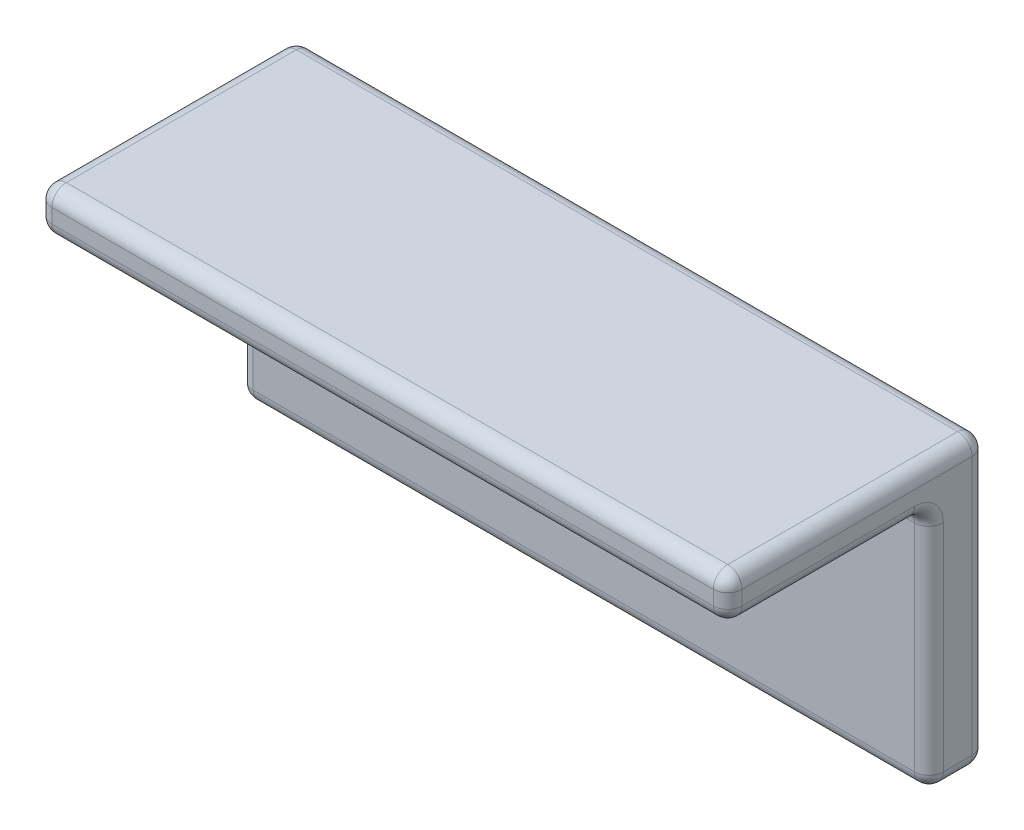
ISO-10303-21;
HEADER;
FILE_DESCRIPTION(('STEP AP214'),'2;1');
FILE_NAME('part.step','',(''),(''),'','','');
FILE_SCHEMA(('AUTOMOTIVE_DESIGN { 1 0 10303 214 1 1 1 1 }'));
ENDSEC;
DATA;
#1=APPLICATION_CONTEXT('core data for automotive mechanical design processes');
#2=APPLICATION_PROTOCOL_DEFINITION('international standard','automotive_design',2000,#1);
#3=PRODUCT_CONTEXT('',#1,'mechanical');
#4=PRODUCT('Part','Part','',(#3));
#5=PRODUCT_RELATED_PRODUCT_CATEGORY('part','',(#4));
#6=PRODUCT_DEFINITION_FORMATION('','',#4);
#7=PRODUCT_DEFINITION_CONTEXT('part definition',#1,'design');
#8=PRODUCT_DEFINITION('design','',#6,#7);
#9=PRODUCT_DEFINITION_SHAPE('','',#8);
#10=(LENGTH_UNIT() NAMED_UNIT(*) SI_UNIT(.MILLI.,.METRE.));
#11=(NAMED_UNIT(*) PLANE_ANGLE_UNIT() SI_UNIT($,.RADIAN.));
#12=(NAMED_UNIT(*) SI_UNIT($,.STERADIAN.) SOLID_ANGLE_UNIT());
#13=UNCERTAINTY_MEASURE_WITH_UNIT(LENGTH_MEASURE(1.E-05),#10,'distance_accuracy_value','');
#14=(GEOMETRIC_REPRESENTATION_CONTEXT(3) GLOBAL_UNCERTAINTY_ASSIGNED_CONTEXT((#13)) GLOBAL_UNIT_ASSIGNED_CONTEXT((#10,
#11,#12)) REPRESENTATION_CONTEXT('',''));
#15=CARTESIAN_POINT('',(0.,0.,0.));
#16=DIRECTION('',(0.,0.,1.));
#17=DIRECTION('',(1.,0.,0.));
#18=AXIS2_PLACEMENT_3D('',#15,#16,#17);
#19=CARTESIAN_POINT('',(0.,0.,2.));
#20=DIRECTION('',(0.,0.,-1.));
#21=DIRECTION('',(-1.,0.,0.));
#22=AXIS2_PLACEMENT_3D('',#19,#20,#21);
#23=PLANE('',#22);
#24=DIRECTION('',(1.,0.,0.));
#25=VECTOR('',#24,1.);
#26=CARTESIAN_POINT('',(0.,0.5,2.));
#27=LINE('',#26,#25);
#28=CARTESIAN_POINT('',(0.5,0.5,2.));
#29=VERTEX_POINT('',#28);
#30=CARTESIAN_POINT('',(23.5,0.5,2.));
#31=VERTEX_POINT('',#30);
#32=EDGE_CURVE('E42',#29,#31,#27,.T.);
#33=ORIENTED_EDGE('',*,*,#32,.T.);
#34=DIRECTION('',(0.,1.,0.));
#35=VECTOR('',#34,1.);
#36=CARTESIAN_POINT('',(23.5,0.,2.));
#37=LINE('',#36,#35);
#38=CARTESIAN_POINT('',(23.5,8.,2.));
#39=VERTEX_POINT('',#38);
#40=EDGE_CURVE('E11',#31,#39,#37,.T.);
#41=ORIENTED_EDGE('',*,*,#40,.T.);
#42=DIRECTION('',(1.,0.,0.));
#43=VECTOR('',#42,1.);
#44=CARTESIAN_POINT('',(0.,8.,2.));
#45=LINE('',#44,#43);
#46=CARTESIAN_POINT('',(0.499999999999997,8.,2.));
#47=VERTEX_POINT('',#46);
#48=EDGE_CURVE('E284',#39,#47,#45,.F.);
#49=ORIENTED_EDGE('',*,*,#48,.T.);
#50=DIRECTION('',(0.,-1.,0.));
#51=VECTOR('',#50,1.);
#52=CARTESIAN_POINT('',(0.5,0.,2.));
#53=LINE('',#52,#51);
#54=EDGE_CURVE('E53',#47,#29,#53,.T.);
#55=ORIENTED_EDGE('',*,*,#54,.T.);
#56=EDGE_LOOP('',(#33,#41,#49,#55));
#57=FACE_BOUND('',#56,.T.);
#58=CARTESIAN_POINT('',(12.,5.,2.));
#59=DIRECTION('',(0.,0.,-1.));
#60=DIRECTION('',(-1.,0.,0.));
#61=AXIS2_PLACEMENT_3D('',#58,#59,#60);
#62=CIRCLE('',#61,2.25);
#63=CARTESIAN_POINT('',(9.75,5.,2.));
#64=VERTEX_POINT('',#63);
#65=EDGE_CURVE('E281',#64,#64,#62,.T.);
#66=ORIENTED_EDGE('',*,*,#65,.T.);
#67=EDGE_LOOP('',(#66));
#68=FACE_BOUND('',#67,.T.);
#69=ADVANCED_FACE('F33',(#57,#68),#23,.F.);
#70=CARTESIAN_POINT('',(0.,0.,0.));
#71=DIRECTION('',(0.,0.,-1.));
#72=DIRECTION('',(-1.,0.,0.));
#73=AXIS2_PLACEMENT_3D('',#70,#71,#72);
#74=PLANE('',#73);
#75=CARTESIAN_POINT('',(12.,5.,0.));
#76=DIRECTION('',(0.,0.,-1.));
#77=DIRECTION('',(-1.,0.,0.));
#78=AXIS2_PLACEMENT_3D('',#75,#76,#77);
#79=CIRCLE('',#78,2.25);
#80=CARTESIAN_POINT('',(9.75,5.,0.));
#81=VERTEX_POINT('',#80);
#82=EDGE_CURVE('E231',#81,#81,#79,.F.);
#83=ORIENTED_EDGE('',*,*,#82,.T.);
#84=EDGE_LOOP('',(#83));
#85=FACE_BOUND('',#84,.T.);
#86=DIRECTION('',(0.,1.,0.));
#87=VECTOR('',#86,1.);
#88=CARTESIAN_POINT('',(23.5,0.,0.));
#89=LINE('',#88,#87);
#90=CARTESIAN_POINT('',(23.5,9.5,0.));
#91=VERTEX_POINT('',#90);
#92=CARTESIAN_POINT('',(23.5,0.5,0.));
#93=VERTEX_POINT('',#92);
#94=EDGE_CURVE('E224',#91,#93,#89,.F.);
#95=ORIENTED_EDGE('',*,*,#94,.T.);
#96=DIRECTION('',(1.,0.,0.));
#97=VECTOR('',#96,1.);
#98=CARTESIAN_POINT('',(0.,0.5,0.));
#99=LINE('',#98,#97);
#100=CARTESIAN_POINT('',(0.5,0.5,0.));
#101=VERTEX_POINT('',#100);
#102=EDGE_CURVE('E228',#93,#101,#99,.F.);
#103=ORIENTED_EDGE('',*,*,#102,.T.);
#104=DIRECTION('',(0.,-1.,0.));
#105=VECTOR('',#104,1.);
#106=CARTESIAN_POINT('',(0.499999999999997,10.,0.));
#107=LINE('',#106,#105);
#108=CARTESIAN_POINT('',(0.499999999999997,9.5,0.));
#109=VERTEX_POINT('',#108);
#110=EDGE_CURVE('E226',#101,#109,#107,.F.);
#111=ORIENTED_EDGE('',*,*,#110,.T.);
#112=DIRECTION('',(-1.,0.,0.));
#113=VECTOR('',#112,1.);
#114=CARTESIAN_POINT('',(24.,9.5,0.));
#115=LINE('',#114,#113);
#116=EDGE_CURVE('E222',#109,#91,#115,.F.);
#117=ORIENTED_EDGE('',*,*,#116,.T.);
#118=EDGE_LOOP('',(#95,#103,#111,#117));
#119=FACE_BOUND('',#118,.T.);
#120=ADVANCED_FACE('F458',(#85,#119),#74,.T.);
#121=CARTESIAN_POINT('',(0.,0.,2.));
#122=DIRECTION('',(1.,0.,0.));
#123=DIRECTION('',(0.,1.,0.));
#124=AXIS2_PLACEMENT_3D('',#121,#122,#123);
#125=PLANE('',#124);
#126=DIRECTION('',(0.,-1.,0.));
#127=VECTOR('',#126,1.);
#128=CARTESIAN_POINT('',(0.,0.,0.5));
#129=LINE('',#128,#127);
#130=CARTESIAN_POINT('',(0.,9.5,0.5));
#131=VERTEX_POINT('',#130);
#132=CARTESIAN_POINT('',(0.,0.5,0.5));
#133=VERTEX_POINT('',#132);
#134=EDGE_CURVE('E217',#131,#133,#129,.T.);
#135=ORIENTED_EDGE('',*,*,#134,.T.);
#136=DIRECTION('',(0.,0.,-1.));
#137=VECTOR('',#136,1.);
#138=CARTESIAN_POINT('',(0.,0.5,2.));
#139=LINE('',#138,#137);
#140=CARTESIAN_POINT('',(0.,0.5,1.5));
#141=VERTEX_POINT('',#140);
#142=EDGE_CURVE('E219',#133,#141,#139,.F.);
#143=ORIENTED_EDGE('',*,*,#142,.T.);
#144=DIRECTION('',(0.,-1.,0.));
#145=VECTOR('',#144,1.);
#146=CARTESIAN_POINT('',(0.,0.,1.5));
#147=LINE('',#146,#145);
#148=CARTESIAN_POINT('',(0.,8.,1.5));
#149=VERTEX_POINT('',#148);
#150=EDGE_CURVE('E209',#141,#149,#147,.F.);
#151=ORIENTED_EDGE('',*,*,#150,.T.);
#152=CARTESIAN_POINT('',(0.,8.,2.5));
#153=DIRECTION('',(1.,0.,0.));
#154=DIRECTION('',(0.,1.,0.));
#155=AXIS2_PLACEMENT_3D('',#152,#153,#154);
#156=CIRCLE('',#155,1.);
#157=CARTESIAN_POINT('',(0.,9.,2.5));
#158=VERTEX_POINT('',#157);
#159=EDGE_CURVE('E206',#158,#149,#156,.F.);
#160=ORIENTED_EDGE('',*,*,#159,.F.);
#161=DIRECTION('',(0.,0.,-1.));
#162=VECTOR('',#161,1.);
#163=CARTESIAN_POINT('',(0.,9.,2.));
#164=LINE('',#163,#162);
#165=CARTESIAN_POINT('',(0.,9.,8.5));
#166=VERTEX_POINT('',#165);
#167=EDGE_CURVE('E211',#158,#166,#164,.F.);
#168=ORIENTED_EDGE('',*,*,#167,.T.);
#169=DIRECTION('',(0.,-1.,0.));
#170=VECTOR('',#169,1.);
#171=CARTESIAN_POINT('',(0.,0.,8.5));
#172=LINE('',#171,#170);
#173=CARTESIAN_POINT('',(0.,9.5,8.5));
#174=VERTEX_POINT('',#173);
#175=EDGE_CURVE('E213',#166,#174,#172,.F.);
#176=ORIENTED_EDGE('',*,*,#175,.T.);
#177=DIRECTION('',(0.,0.,-1.));
#178=VECTOR('',#177,1.);
#179=CARTESIAN_POINT('',(0.,9.5,2.));
#180=LINE('',#179,#178);
#181=EDGE_CURVE('E215',#174,#131,#180,.T.);
#182=ORIENTED_EDGE('',*,*,#181,.T.);
#183=EDGE_LOOP('',(#135,#143,#151,#160,#168,#176,#182));
#184=FACE_BOUND('',#183,.T.);
#185=ADVANCED_FACE('F463',(#184),#125,.F.);
#186=CARTESIAN_POINT('',(0.,0.,2.));
#187=DIRECTION('',(0.,1.,0.));
#188=DIRECTION('',(0.,0.,1.));
#189=AXIS2_PLACEMENT_3D('',#186,#187,#188);
#190=PLANE('',#189);
#191=DIRECTION('',(1.,0.,0.));
#192=VECTOR('',#191,1.);
#193=CARTESIAN_POINT('',(0.,0.,1.5));
#194=LINE('',#193,#192);
#195=CARTESIAN_POINT('',(23.5,0.,1.5));
#196=VERTEX_POINT('',#195);
#197=CARTESIAN_POINT('',(0.5,0.,1.5));
#198=VERTEX_POINT('',#197);
#199=EDGE_CURVE('E167',#196,#198,#194,.F.);
#200=ORIENTED_EDGE('',*,*,#199,.T.);
#201=DIRECTION('',(0.,0.,-1.));
#202=VECTOR('',#201,1.);
#203=CARTESIAN_POINT('',(0.5,0.,2.));
#204=LINE('',#203,#202);
#205=CARTESIAN_POINT('',(0.5,0.,0.5));
#206=VERTEX_POINT('',#205);
#207=EDGE_CURVE('E204',#198,#206,#204,.T.);
#208=ORIENTED_EDGE('',*,*,#207,.T.);
#209=DIRECTION('',(1.,0.,0.));
#210=VECTOR('',#209,1.);
#211=CARTESIAN_POINT('',(24.,0.,0.5));
#212=LINE('',#211,#210);
#213=CARTESIAN_POINT('',(23.5,0.,0.5));
#214=VERTEX_POINT('',#213);
#215=EDGE_CURVE('E170',#206,#214,#212,.T.);
#216=ORIENTED_EDGE('',*,*,#215,.T.);
#217=DIRECTION('',(0.,0.,-1.));
#218=VECTOR('',#217,1.);
#219=CARTESIAN_POINT('',(23.5,0.,2.));
#220=LINE('',#219,#218);
#221=EDGE_CURVE('E162',#214,#196,#220,.F.);
#222=ORIENTED_EDGE('',*,*,#221,.T.);
#223=EDGE_LOOP('',(#200,#208,#216,#222));
#224=FACE_BOUND('',#223,.T.);
#225=ADVANCED_FACE('F164',(#224),#190,.F.);
#226=CARTESIAN_POINT('',(24.,0.,2.));
#227=DIRECTION('',(-1.,0.,0.));
#228=DIRECTION('',(0.,-1.,0.));
#229=AXIS2_PLACEMENT_3D('',#226,#227,#228);
#230=PLANE('',#229);
#231=DIRECTION('',(0.,1.,0.));
#232=VECTOR('',#231,1.);
#233=CARTESIAN_POINT('',(24.,0.,1.5));
#234=LINE('',#233,#232);
#235=CARTESIAN_POINT('',(24.,8.,1.5));
#236=VERTEX_POINT('',#235);
#237=CARTESIAN_POINT('',(24.,0.5,1.5));
#238=VERTEX_POINT('',#237);
#239=EDGE_CURVE('E240',#236,#238,#234,.F.);
#240=ORIENTED_EDGE('',*,*,#239,.T.);
#241=DIRECTION('',(0.,0.,-1.));
#242=VECTOR('',#241,1.);
#243=CARTESIAN_POINT('',(24.,0.5,2.));
#244=LINE('',#243,#242);
#245=CARTESIAN_POINT('',(24.,0.5,0.5));
#246=VERTEX_POINT('',#245);
#247=EDGE_CURVE('E181',#238,#246,#244,.T.);
#248=ORIENTED_EDGE('',*,*,#247,.T.);
#249=DIRECTION('',(0.,1.,0.));
#250=VECTOR('',#249,1.);
#251=CARTESIAN_POINT('',(24.,10.,0.5));
#252=LINE('',#251,#250);
#253=CARTESIAN_POINT('',(24.,9.5,0.5));
#254=VERTEX_POINT('',#253);
#255=EDGE_CURVE('E251',#246,#254,#252,.T.);
#256=ORIENTED_EDGE('',*,*,#255,.T.);
#257=DIRECTION('',(0.,0.,-1.));
#258=VECTOR('',#257,1.);
#259=CARTESIAN_POINT('',(24.,9.5,2.));
#260=LINE('',#259,#258);
#261=CARTESIAN_POINT('',(24.,9.5,8.5));
#262=VERTEX_POINT('',#261);
#263=EDGE_CURVE('E249',#254,#262,#260,.F.);
#264=ORIENTED_EDGE('',*,*,#263,.T.);
#265=DIRECTION('',(0.,1.,0.));
#266=VECTOR('',#265,1.);
#267=CARTESIAN_POINT('',(24.,0.,8.5));
#268=LINE('',#267,#266);
#269=CARTESIAN_POINT('',(24.,9.,8.5));
#270=VERTEX_POINT('',#269);
#271=EDGE_CURVE('E247',#262,#270,#268,.F.);
#272=ORIENTED_EDGE('',*,*,#271,.T.);
#273=DIRECTION('',(0.,0.,-1.));
#274=VECTOR('',#273,1.);
#275=CARTESIAN_POINT('',(24.,9.,2.));
#276=LINE('',#275,#274);
#277=CARTESIAN_POINT('',(24.,9.,2.5));
#278=VERTEX_POINT('',#277);
#279=EDGE_CURVE('E245',#270,#278,#276,.T.);
#280=ORIENTED_EDGE('',*,*,#279,.T.);
#281=CARTESIAN_POINT('',(24.,8.,2.5));
#282=DIRECTION('',(-1.,0.,0.));
#283=DIRECTION('',(0.,-1.,0.));
#284=AXIS2_PLACEMENT_3D('',#281,#282,#283);
#285=CIRCLE('',#284,1.);
#286=EDGE_CURVE('E242',#236,#278,#285,.F.);
#287=ORIENTED_EDGE('',*,*,#286,.F.);
#288=EDGE_LOOP('',(#240,#248,#256,#264,#272,#280,#287));
#289=FACE_BOUND('',#288,.T.);
#290=ADVANCED_FACE('F419',(#289),#230,.F.);
#291=CARTESIAN_POINT('',(0.,10.,2.));
#292=DIRECTION('',(0.,-1.,0.));
#293=DIRECTION('',(0.,0.,-1.));
#294=AXIS2_PLACEMENT_3D('',#291,#292,#293);
#295=PLANE('',#294);
#296=DIRECTION('',(0.,0.,-1.));
#297=VECTOR('',#296,1.);
#298=CARTESIAN_POINT('',(23.5,10.,2.));
#299=LINE('',#298,#297);
#300=CARTESIAN_POINT('',(23.5,10.,8.5));
#301=VERTEX_POINT('',#300);
#302=CARTESIAN_POINT('',(23.5,10.,0.5));
#303=VERTEX_POINT('',#302);
#304=EDGE_CURVE('E258',#301,#303,#299,.T.);
#305=ORIENTED_EDGE('',*,*,#304,.T.);
#306=DIRECTION('',(-1.,0.,0.));
#307=VECTOR('',#306,1.);
#308=CARTESIAN_POINT('',(0.,10.,0.5));
#309=LINE('',#308,#307);
#310=CARTESIAN_POINT('',(0.499999999999997,10.,0.5));
#311=VERTEX_POINT('',#310);
#312=EDGE_CURVE('E261',#303,#311,#309,.T.);
#313=ORIENTED_EDGE('',*,*,#312,.T.);
#314=DIRECTION('',(0.,0.,-1.));
#315=VECTOR('',#314,1.);
#316=CARTESIAN_POINT('',(0.499999999999997,10.,2.));
#317=LINE('',#316,#315);
#318=CARTESIAN_POINT('',(0.499999999999997,10.,8.5));
#319=VERTEX_POINT('',#318);
#320=EDGE_CURVE('E256',#311,#319,#317,.F.);
#321=ORIENTED_EDGE('',*,*,#320,.T.);
#322=DIRECTION('',(-1.,0.,0.));
#323=VECTOR('',#322,1.);
#324=CARTESIAN_POINT('',(0.,10.,8.5));
#325=LINE('',#324,#323);
#326=EDGE_CURVE('E254',#319,#301,#325,.F.);
#327=ORIENTED_EDGE('',*,*,#326,.T.);
#328=EDGE_LOOP('',(#305,#313,#321,#327));
#329=FACE_BOUND('',#328,.T.);
#330=ADVANCED_FACE('F385',(#329),#295,.F.);
#331=CARTESIAN_POINT('',(12.,5.,2.));
#332=DIRECTION('',(0.,0.,-1.));
#333=DIRECTION('',(-1.,0.,0.));
#334=AXIS2_PLACEMENT_3D('',#331,#332,#333);
#335=CYLINDRICAL_SURFACE('',#334,1.75);
#336=CARTESIAN_POINT('',(12.,5.,0.5));
#337=DIRECTION('',(0.,0.,-1.));
#338=DIRECTION('',(-1.,0.,0.));
#339=AXIS2_PLACEMENT_3D('',#336,#337,#338);
#340=CIRCLE('',#339,1.75);
#341=CARTESIAN_POINT('',(10.25,5.,0.5));
#342=VERTEX_POINT('',#341);
#343=EDGE_CURVE('E237',#342,#342,#340,.T.);
#344=ORIENTED_EDGE('',*,*,#343,.T.);
#345=EDGE_LOOP('',(#344));
#346=FACE_BOUND('',#345,.T.);
#347=CARTESIAN_POINT('',(12.,5.,1.5));
#348=DIRECTION('',(0.,0.,-1.));
#349=DIRECTION('',(-1.,0.,0.));
#350=AXIS2_PLACEMENT_3D('',#347,#348,#349);
#351=CIRCLE('',#350,1.75);
#352=CARTESIAN_POINT('',(10.25,5.,1.5));
#353=VERTEX_POINT('',#352);
#354=EDGE_CURVE('E234',#353,#353,#351,.F.);
#355=ORIENTED_EDGE('',*,*,#354,.T.);
#356=EDGE_LOOP('',(#355));
#357=FACE_BOUND('',#356,.T.);
#358=ADVANCED_FACE('F468',(#346,#357),#335,.F.);
#359=CARTESIAN_POINT('',(24.,8.5,9.));
#360=DIRECTION('',(0.,1.,0.));
#361=DIRECTION('',(-1.,0.,0.));
#362=AXIS2_PLACEMENT_3D('',#359,#360,#361);
#363=PLANE('',#362);
#364=DIRECTION('',(1.,0.,0.));
#365=VECTOR('',#364,1.);
#366=CARTESIAN_POINT('',(24.,8.5,8.5));
#367=LINE('',#366,#365);
#368=CARTESIAN_POINT('',(23.5,8.5,8.5));
#369=VERTEX_POINT('',#368);
#370=CARTESIAN_POINT('',(0.499999999999997,8.5,8.5));
#371=VERTEX_POINT('',#370);
#372=EDGE_CURVE('E276',#369,#371,#367,.F.);
#373=ORIENTED_EDGE('',*,*,#372,.T.);
#374=DIRECTION('',(0.,0.,-1.));
#375=VECTOR('',#374,1.);
#376=CARTESIAN_POINT('',(0.499999999999997,8.5,9.));
#377=LINE('',#376,#375);
#378=CARTESIAN_POINT('',(0.499999999999997,8.5,2.5));
#379=VERTEX_POINT('',#378);
#380=EDGE_CURVE('E278',#371,#379,#377,.T.);
#381=ORIENTED_EDGE('',*,*,#380,.T.);
#382=DIRECTION('',(1.,0.,0.));
#383=VECTOR('',#382,1.);
#384=CARTESIAN_POINT('',(24.,8.5,2.5));
#385=LINE('',#384,#383);
#386=CARTESIAN_POINT('',(23.5,8.5,2.5));
#387=VERTEX_POINT('',#386);
#388=EDGE_CURVE('E272',#379,#387,#385,.T.);
#389=ORIENTED_EDGE('',*,*,#388,.T.);
#390=DIRECTION('',(0.,0.,-1.));
#391=VECTOR('',#390,1.);
#392=CARTESIAN_POINT('',(23.5,8.5,9.));
#393=LINE('',#392,#391);
#394=EDGE_CURVE('E274',#387,#369,#393,.F.);
#395=ORIENTED_EDGE('',*,*,#394,.T.);
#396=EDGE_LOOP('',(#373,#381,#389,#395));
#397=FACE_BOUND('',#396,.T.);
#398=ADVANCED_FACE('F589',(#397),#363,.F.);
#399=CARTESIAN_POINT('',(0.,0.,9.));
#400=DIRECTION('',(0.,0.,-1.));
#401=DIRECTION('',(-1.,0.,0.));
#402=AXIS2_PLACEMENT_3D('',#399,#400,#401);
#403=PLANE('',#402);
#404=DIRECTION('',(-1.,0.,0.));
#405=VECTOR('',#404,1.);
#406=CARTESIAN_POINT('',(0.,9.5,9.));
#407=LINE('',#406,#405);
#408=CARTESIAN_POINT('',(23.5,9.5,9.));
#409=VERTEX_POINT('',#408);
#410=CARTESIAN_POINT('',(0.499999999999997,9.5,9.));
#411=VERTEX_POINT('',#410);
#412=EDGE_CURVE('E267',#409,#411,#407,.T.);
#413=ORIENTED_EDGE('',*,*,#412,.T.);
#414=DIRECTION('',(0.,-1.,0.));
#415=VECTOR('',#414,1.);
#416=CARTESIAN_POINT('',(0.5,0.,9.));
#417=LINE('',#416,#415);
#418=CARTESIAN_POINT('',(0.499999999999997,9.,9.));
#419=VERTEX_POINT('',#418);
#420=EDGE_CURVE('E269',#411,#419,#417,.T.);
#421=ORIENTED_EDGE('',*,*,#420,.T.);
#422=DIRECTION('',(1.,0.,0.));
#423=VECTOR('',#422,1.);
#424=CARTESIAN_POINT('',(0.,9.,9.));
#425=LINE('',#424,#423);
#426=CARTESIAN_POINT('',(23.5,9.,9.));
#427=VERTEX_POINT('',#426);
#428=EDGE_CURVE('E263',#419,#427,#425,.T.);
#429=ORIENTED_EDGE('',*,*,#428,.T.);
#430=DIRECTION('',(0.,1.,0.));
#431=VECTOR('',#430,1.);
#432=CARTESIAN_POINT('',(23.5,0.,9.));
#433=LINE('',#432,#431);
#434=EDGE_CURVE('E265',#427,#409,#433,.T.);
#435=ORIENTED_EDGE('',*,*,#434,.T.);
#436=EDGE_LOOP('',(#413,#421,#429,#435));
#437=FACE_BOUND('',#436,.T.);
#438=ADVANCED_FACE('F393',(#437),#403,.F.);
#439=CARTESIAN_POINT('',(23.5,0.,8.5));
#440=DIRECTION('',(0.,1.,0.));
#441=DIRECTION('',(-1.,0.,0.));
#442=AXIS2_PLACEMENT_3D('',#439,#440,#441);
#443=CYLINDRICAL_SURFACE('',#442,0.5);
#444=CARTESIAN_POINT('',(23.5,9.,8.5));
#445=DIRECTION('',(0.,-1.,0.));
#446=DIRECTION('',(0.,0.,-1.));
#447=AXIS2_PLACEMENT_3D('',#444,#445,#446);
#448=CIRCLE('',#447,0.5);
#449=EDGE_CURVE('E37',#270,#427,#448,.T.);
#450=ORIENTED_EDGE('',*,*,#449,.F.);
#451=ORIENTED_EDGE('',*,*,#271,.F.);
#452=CARTESIAN_POINT('',(23.5,9.5,8.5));
#453=DIRECTION('',(0.,1.,0.));
#454=DIRECTION('',(0.,0.,1.));
#455=AXIS2_PLACEMENT_3D('',#452,#453,#454);
#456=CIRCLE('',#455,0.5);
#457=EDGE_CURVE('E201',#409,#262,#456,.T.);
#458=ORIENTED_EDGE('',*,*,#457,.F.);
#459=ORIENTED_EDGE('',*,*,#434,.F.);
#460=EDGE_LOOP('',(#450,#451,#458,#459));
#461=FACE_BOUND('',#460,.T.);
#462=ADVANCED_FACE('F409',(#461),#443,.T.);
#463=CARTESIAN_POINT('',(23.5,9.,8.5));
#464=DIRECTION('',(0.,0.,1.));
#465=DIRECTION('',(1.,0.,0.));
#466=AXIS2_PLACEMENT_3D('',#463,#464,#465);
#467=SPHERICAL_SURFACE('',#466,0.5);
#468=CARTESIAN_POINT('',(23.5,9.,8.5));
#469=DIRECTION('',(0.,0.,1.));
#470=DIRECTION('',(1.,0.,0.));
#471=AXIS2_PLACEMENT_3D('',#468,#469,#470);
#472=CIRCLE('',#471,0.5);
#473=EDGE_CURVE('E364',#270,#369,#472,.F.);
#474=ORIENTED_EDGE('',*,*,#473,.F.);
#475=ORIENTED_EDGE('',*,*,#449,.T.);
#476=CARTESIAN_POINT('',(23.5,9.,8.5));
#477=DIRECTION('',(1.,0.,0.));
#478=DIRECTION('',(0.,0.,-1.));
#479=AXIS2_PLACEMENT_3D('',#476,#477,#478);
#480=CIRCLE('',#479,0.5);
#481=EDGE_CURVE('E367',#369,#427,#480,.F.);
#482=ORIENTED_EDGE('',*,*,#481,.F.);
#483=EDGE_LOOP('',(#474,#475,#482));
#484=FACE_BOUND('',#483,.T.);
#485=ADVANCED_FACE('F412',(#484),#467,.T.);
#486=CARTESIAN_POINT('',(23.5,9.5,8.5));
#487=DIRECTION('',(0.,0.,1.));
#488=DIRECTION('',(1.,0.,0.));
#489=AXIS2_PLACEMENT_3D('',#486,#487,#488);
#490=SPHERICAL_SURFACE('',#489,0.5);
#491=CARTESIAN_POINT('',(23.5,9.5,8.5));
#492=DIRECTION('',(1.,0.,0.));
#493=DIRECTION('',(0.,0.,-1.));
#494=AXIS2_PLACEMENT_3D('',#491,#492,#493);
#495=CIRCLE('',#494,0.5);
#496=EDGE_CURVE('E358',#409,#301,#495,.F.);
#497=ORIENTED_EDGE('',*,*,#496,.F.);
#498=ORIENTED_EDGE('',*,*,#457,.T.);
#499=CARTESIAN_POINT('',(23.5,9.5,8.5));
#500=DIRECTION('',(0.,0.,1.));
#501=DIRECTION('',(1.,0.,0.));
#502=AXIS2_PLACEMENT_3D('',#499,#500,#501);
#503=CIRCLE('',#502,0.5);
#504=EDGE_CURVE('E361',#301,#262,#503,.F.);
#505=ORIENTED_EDGE('',*,*,#504,.F.);
#506=EDGE_LOOP('',(#497,#498,#505));
#507=FACE_BOUND('',#506,.T.);
#508=ADVANCED_FACE('F374',(#507),#490,.T.);
#509=CARTESIAN_POINT('',(0.,9.,8.5));
#510=DIRECTION('',(1.,0.,0.));
#511=DIRECTION('',(0.,1.,0.));
#512=AXIS2_PLACEMENT_3D('',#509,#510,#511);
#513=CYLINDRICAL_SURFACE('',#512,0.5);
#514=ORIENTED_EDGE('',*,*,#481,.T.);
#515=ORIENTED_EDGE('',*,*,#428,.F.);
#516=CARTESIAN_POINT('',(0.499999999999997,9.,8.5));
#517=DIRECTION('',(-1.,0.,0.));
#518=DIRECTION('',(0.,0.,1.));
#519=AXIS2_PLACEMENT_3D('',#516,#517,#518);
#520=CIRCLE('',#519,0.5);
#521=EDGE_CURVE('E353',#371,#419,#520,.T.);
#522=ORIENTED_EDGE('',*,*,#521,.F.);
#523=ORIENTED_EDGE('',*,*,#372,.F.);
#524=EDGE_LOOP('',(#514,#515,#522,#523));
#525=FACE_BOUND('',#524,.T.);
#526=ADVANCED_FACE('F405',(#525),#513,.T.);
#527=CARTESIAN_POINT('',(23.5,9.,2.));
#528=DIRECTION('',(0.,0.,-1.));
#529=DIRECTION('',(-1.,0.,0.));
#530=AXIS2_PLACEMENT_3D('',#527,#528,#529);
#531=CYLINDRICAL_SURFACE('',#530,0.5);
#532=ORIENTED_EDGE('',*,*,#473,.T.);
#533=ORIENTED_EDGE('',*,*,#394,.F.);
#534=CARTESIAN_POINT('',(23.5,9.,2.5));
#535=DIRECTION('',(0.,0.,-1.));
#536=DIRECTION('',(-1.,0.,0.));
#537=AXIS2_PLACEMENT_3D('',#534,#535,#536);
#538=CIRCLE('',#537,0.5);
#539=EDGE_CURVE('E350',#278,#387,#538,.T.);
#540=ORIENTED_EDGE('',*,*,#539,.F.);
#541=ORIENTED_EDGE('',*,*,#279,.F.);
#542=EDGE_LOOP('',(#532,#533,#540,#541));
#543=FACE_BOUND('',#542,.T.);
#544=ADVANCED_FACE('F417',(#543),#531,.T.);
#545=CARTESIAN_POINT('',(23.5,9.5,2.));
#546=DIRECTION('',(0.,0.,-1.));
#547=DIRECTION('',(-1.,0.,0.));
#548=AXIS2_PLACEMENT_3D('',#545,#546,#547);
#549=CYLINDRICAL_SURFACE('',#548,0.5);
#550=ORIENTED_EDGE('',*,*,#504,.T.);
#551=ORIENTED_EDGE('',*,*,#263,.F.);
#552=CARTESIAN_POINT('',(23.5,9.5,0.5));
#553=DIRECTION('',(0.,0.,-1.));
#554=DIRECTION('',(-1.,0.,0.));
#555=AXIS2_PLACEMENT_3D('',#552,#553,#554);
#556=CIRCLE('',#555,0.5);
#557=EDGE_CURVE('E347',#303,#254,#556,.T.);
#558=ORIENTED_EDGE('',*,*,#557,.F.);
#559=ORIENTED_EDGE('',*,*,#304,.F.);
#560=EDGE_LOOP('',(#550,#551,#558,#559));
#561=FACE_BOUND('',#560,.T.);
#562=ADVANCED_FACE('F382',(#561),#549,.T.);
#563=CARTESIAN_POINT('',(0.,9.5,8.5));
#564=DIRECTION('',(-1.,0.,0.));
#565=DIRECTION('',(0.,0.,1.));
#566=AXIS2_PLACEMENT_3D('',#563,#564,#565);
#567=CYLINDRICAL_SURFACE('',#566,0.5);
#568=ORIENTED_EDGE('',*,*,#496,.T.);
#569=ORIENTED_EDGE('',*,*,#326,.F.);
#570=CARTESIAN_POINT('',(0.499999999999997,9.5,8.5));
#571=DIRECTION('',(-1.,0.,0.));
#572=DIRECTION('',(0.,0.,1.));
#573=AXIS2_PLACEMENT_3D('',#570,#571,#572);
#574=CIRCLE('',#573,0.5);
#575=EDGE_CURVE('E344',#411,#319,#574,.T.);
#576=ORIENTED_EDGE('',*,*,#575,.F.);
#577=ORIENTED_EDGE('',*,*,#412,.F.);
#578=EDGE_LOOP('',(#568,#569,#576,#577));
#579=FACE_BOUND('',#578,.T.);
#580=ADVANCED_FACE('F390',(#579),#567,.T.);
#581=CARTESIAN_POINT('',(0.5,0.,8.5));
#582=DIRECTION('',(0.,-1.,0.));
#583=DIRECTION('',(1.,0.,0.));
#584=AXIS2_PLACEMENT_3D('',#581,#582,#583);
#585=CYLINDRICAL_SURFACE('',#584,0.5);
#586=CARTESIAN_POINT('',(0.499999999999997,9.,8.5));
#587=DIRECTION('',(0.,-1.,0.));
#588=DIRECTION('',(0.,0.,-1.));
#589=AXIS2_PLACEMENT_3D('',#586,#587,#588);
#590=CIRCLE('',#589,0.5);
#591=EDGE_CURVE('E355',#419,#166,#590,.T.);
#592=ORIENTED_EDGE('',*,*,#591,.F.);
#593=ORIENTED_EDGE('',*,*,#420,.F.);
#594=CARTESIAN_POINT('',(0.499999999999997,9.5,8.5));
#595=DIRECTION('',(0.,1.,0.));
#596=DIRECTION('',(0.,0.,1.));
#597=AXIS2_PLACEMENT_3D('',#594,#595,#596);
#598=CIRCLE('',#597,0.5);
#599=EDGE_CURVE('E341',#174,#411,#598,.T.);
#600=ORIENTED_EDGE('',*,*,#599,.F.);
#601=ORIENTED_EDGE('',*,*,#175,.F.);
#602=EDGE_LOOP('',(#592,#593,#600,#601));
#603=FACE_BOUND('',#602,.T.);
#604=ADVANCED_FACE('F397',(#603),#585,.T.);
#605=CARTESIAN_POINT('',(0.499999999999997,9.,8.5));
#606=DIRECTION('',(0.,0.,1.));
#607=DIRECTION('',(1.,0.,0.));
#608=AXIS2_PLACEMENT_3D('',#605,#606,#607);
#609=SPHERICAL_SURFACE('',#608,0.5);
#610=ORIENTED_EDGE('',*,*,#521,.T.);
#611=ORIENTED_EDGE('',*,*,#591,.T.);
#612=CARTESIAN_POINT('',(0.499999999999997,9.,8.5));
#613=DIRECTION('',(0.,0.,1.));
#614=DIRECTION('',(1.,0.,0.));
#615=AXIS2_PLACEMENT_3D('',#612,#613,#614);
#616=CIRCLE('',#615,0.5);
#617=EDGE_CURVE('E338',#371,#166,#616,.F.);
#618=ORIENTED_EDGE('',*,*,#617,.F.);
#619=EDGE_LOOP('',(#610,#611,#618));
#620=FACE_BOUND('',#619,.T.);
#621=ADVANCED_FACE('F554',(#620),#609,.T.);
#622=CARTESIAN_POINT('',(23.5,8.,2.5));
#623=DIRECTION('',(-1.,0.,0.));
#624=DIRECTION('',(0.,-1.,0.));
#625=AXIS2_PLACEMENT_3D('',#622,#623,#624);
#626=TOROIDAL_SURFACE('',#625,1.,0.5);
#627=ORIENTED_EDGE('',*,*,#286,.T.);
#628=ORIENTED_EDGE('',*,*,#539,.T.);
#629=CARTESIAN_POINT('',(23.5,8.,2.5));
#630=DIRECTION('',(-1.,0.,0.));
#631=DIRECTION('',(0.,-1.,0.));
#632=AXIS2_PLACEMENT_3D('',#629,#630,#631);
#633=CIRCLE('',#632,0.5);
#634=EDGE_CURVE('E335',#39,#387,#633,.F.);
#635=ORIENTED_EDGE('',*,*,#634,.F.);
#636=CARTESIAN_POINT('',(23.5,8.,1.5));
#637=DIRECTION('',(0.,1.,0.));
#638=DIRECTION('',(0.,0.,1.));
#639=AXIS2_PLACEMENT_3D('',#636,#637,#638);
#640=CIRCLE('',#639,0.5);
#641=EDGE_CURVE('E332',#236,#39,#640,.F.);
#642=ORIENTED_EDGE('',*,*,#641,.F.);
#643=EDGE_LOOP('',(#627,#628,#635,#642));
#644=FACE_BOUND('',#643,.T.);
#645=ADVANCED_FACE('F455',(#644),#626,.T.);
#646=CARTESIAN_POINT('',(23.5,9.5,0.5));
#647=DIRECTION('',(0.,0.,1.));
#648=DIRECTION('',(1.,0.,0.));
#649=AXIS2_PLACEMENT_3D('',#646,#647,#648);
#650=SPHERICAL_SURFACE('',#649,0.5);
#651=CARTESIAN_POINT('',(23.5,9.5,0.5));
#652=DIRECTION('',(1.,0.,0.));
#653=DIRECTION('',(0.,0.,-1.));
#654=AXIS2_PLACEMENT_3D('',#651,#652,#653);
#655=CIRCLE('',#654,0.5);
#656=EDGE_CURVE('E326',#303,#91,#655,.F.);
#657=ORIENTED_EDGE('',*,*,#656,.F.);
#658=ORIENTED_EDGE('',*,*,#557,.T.);
#659=CARTESIAN_POINT('',(23.5,9.5,0.5));
#660=DIRECTION('',(0.,1.,0.));
#661=DIRECTION('',(0.,0.,1.));
#662=AXIS2_PLACEMENT_3D('',#659,#660,#661);
#663=CIRCLE('',#662,0.5);
#664=EDGE_CURVE('E329',#91,#254,#663,.F.);
#665=ORIENTED_EDGE('',*,*,#664,.F.);
#666=EDGE_LOOP('',(#657,#658,#665));
#667=FACE_BOUND('',#666,.T.);
#668=ADVANCED_FACE('F430',(#667),#650,.T.);
#669=CARTESIAN_POINT('',(0.499999999999997,9.5,8.5));
#670=DIRECTION('',(0.,0.,1.));
#671=DIRECTION('',(1.,0.,0.));
#672=AXIS2_PLACEMENT_3D('',#669,#670,#671);
#673=SPHERICAL_SURFACE('',#672,0.5);
#674=ORIENTED_EDGE('',*,*,#599,.T.);
#675=ORIENTED_EDGE('',*,*,#575,.T.);
#676=CARTESIAN_POINT('',(0.499999999999997,9.5,8.5));
#677=DIRECTION('',(0.,0.,1.));
#678=DIRECTION('',(1.,0.,0.));
#679=AXIS2_PLACEMENT_3D('',#676,#677,#678);
#680=CIRCLE('',#679,0.5);
#681=EDGE_CURVE('E323',#174,#319,#680,.F.);
#682=ORIENTED_EDGE('',*,*,#681,.F.);
#683=EDGE_LOOP('',(#674,#675,#682));
#684=FACE_BOUND('',#683,.T.);
#685=ADVANCED_FACE('F444',(#684),#673,.T.);
#686=CARTESIAN_POINT('',(0.499999999999997,9.,9.));
#687=DIRECTION('',(0.,0.,-1.));
#688=DIRECTION('',(-1.,0.,0.));
#689=AXIS2_PLACEMENT_3D('',#686,#687,#688);
#690=CYLINDRICAL_SURFACE('',#689,0.5);
#691=ORIENTED_EDGE('',*,*,#617,.T.);
#692=ORIENTED_EDGE('',*,*,#167,.F.);
#693=CARTESIAN_POINT('',(0.499999999999997,9.,2.5));
#694=DIRECTION('',(0.,0.,-1.));
#695=DIRECTION('',(-1.,0.,0.));
#696=AXIS2_PLACEMENT_3D('',#693,#694,#695);
#697=CIRCLE('',#696,0.5);
#698=EDGE_CURVE('E320',#379,#158,#697,.T.);
#699=ORIENTED_EDGE('',*,*,#698,.F.);
#700=ORIENTED_EDGE('',*,*,#380,.F.);
#701=EDGE_LOOP('',(#691,#692,#699,#700));
#702=FACE_BOUND('',#701,.T.);
#703=ADVANCED_FACE('F446',(#702),#690,.T.);
#704=CARTESIAN_POINT('',(24.,8.,2.5));
#705=DIRECTION('',(-1.,0.,0.));
#706=DIRECTION('',(0.,-1.,0.));
#707=AXIS2_PLACEMENT_3D('',#704,#705,#706);
#708=CYLINDRICAL_SURFACE('',#707,0.5);
#709=ORIENTED_EDGE('',*,*,#634,.T.);
#710=ORIENTED_EDGE('',*,*,#388,.F.);
#711=CARTESIAN_POINT('',(0.499999999999997,8.,2.5));
#712=DIRECTION('',(1.,0.,0.));
#713=DIRECTION('',(0.,1.,0.));
#714=AXIS2_PLACEMENT_3D('',#711,#712,#713);
#715=CIRCLE('',#714,0.5);
#716=EDGE_CURVE('E318',#47,#379,#715,.T.);
#717=ORIENTED_EDGE('',*,*,#716,.F.);
#718=ORIENTED_EDGE('',*,*,#48,.F.);
#719=EDGE_LOOP('',(#709,#710,#717,#718));
#720=FACE_BOUND('',#719,.T.);
#721=ADVANCED_FACE('F452',(#720),#708,.F.);
#722=CARTESIAN_POINT('',(23.5,0.,1.5));
#723=DIRECTION('',(0.,1.,0.));
#724=DIRECTION('',(-1.,0.,0.));
#725=AXIS2_PLACEMENT_3D('',#722,#723,#724);
#726=CYLINDRICAL_SURFACE('',#725,0.5);
#727=ORIENTED_EDGE('',*,*,#641,.T.);
#728=ORIENTED_EDGE('',*,*,#40,.F.);
#729=CARTESIAN_POINT('',(23.5,0.5,1.5));
#730=DIRECTION('',(0.,-1.,0.));
#731=DIRECTION('',(1.,0.,0.));
#732=AXIS2_PLACEMENT_3D('',#729,#730,#731);
#733=CIRCLE('',#732,0.5);
#734=EDGE_CURVE('E185',#238,#31,#733,.T.);
#735=ORIENTED_EDGE('',*,*,#734,.F.);
#736=ORIENTED_EDGE('',*,*,#239,.F.);
#737=EDGE_LOOP('',(#727,#728,#735,#736));
#738=FACE_BOUND('',#737,.T.);
#739=ADVANCED_FACE('F527',(#738),#726,.T.);
#740=CARTESIAN_POINT('',(23.5,0.5,2.));
#741=DIRECTION('',(0.,0.,-1.));
#742=DIRECTION('',(-1.,0.,0.));
#743=AXIS2_PLACEMENT_3D('',#740,#741,#742);
#744=CYLINDRICAL_SURFACE('',#743,0.5);
#745=CARTESIAN_POINT('',(23.5,0.5,0.5));
#746=DIRECTION('',(0.,0.,-1.));
#747=DIRECTION('',(-1.,0.,0.));
#748=AXIS2_PLACEMENT_3D('',#745,#746,#747);
#749=CIRCLE('',#748,0.5);
#750=EDGE_CURVE('E186',#246,#214,#749,.T.);
#751=ORIENTED_EDGE('',*,*,#750,.F.);
#752=ORIENTED_EDGE('',*,*,#247,.F.);
#753=CARTESIAN_POINT('',(23.5,0.5,1.5));
#754=DIRECTION('',(0.,0.,1.));
#755=DIRECTION('',(1.,0.,0.));
#756=AXIS2_PLACEMENT_3D('',#753,#754,#755);
#757=CIRCLE('',#756,0.5);
#758=EDGE_CURVE('E177',#196,#238,#757,.T.);
#759=ORIENTED_EDGE('',*,*,#758,.F.);
#760=ORIENTED_EDGE('',*,*,#221,.F.);
#761=EDGE_LOOP('',(#751,#752,#759,#760));
#762=FACE_BOUND('',#761,.T.);
#763=ADVANCED_FACE('F179',(#762),#744,.T.);
#764=CARTESIAN_POINT('',(23.5,0.,0.5));
#765=DIRECTION('',(0.,-1.,0.));
#766=DIRECTION('',(1.,0.,0.));
#767=AXIS2_PLACEMENT_3D('',#764,#765,#766);
#768=CYLINDRICAL_SURFACE('',#767,0.5);
#769=ORIENTED_EDGE('',*,*,#664,.T.);
#770=ORIENTED_EDGE('',*,*,#255,.F.);
#771=CARTESIAN_POINT('',(23.5,0.5,0.5));
#772=DIRECTION('',(0.,-1.,0.));
#773=DIRECTION('',(1.,0.,0.));
#774=AXIS2_PLACEMENT_3D('',#771,#772,#773);
#775=CIRCLE('',#774,0.5);
#776=EDGE_CURVE('E314',#93,#246,#775,.T.);
#777=ORIENTED_EDGE('',*,*,#776,.F.);
#778=ORIENTED_EDGE('',*,*,#94,.F.);
#779=EDGE_LOOP('',(#769,#770,#777,#778));
#780=FACE_BOUND('',#779,.T.);
#781=ADVANCED_FACE('F424',(#780),#768,.T.);
#782=CARTESIAN_POINT('',(0.,9.5,0.5));
#783=DIRECTION('',(1.,0.,0.));
#784=DIRECTION('',(0.,0.,-1.));
#785=AXIS2_PLACEMENT_3D('',#782,#783,#784);
#786=CYLINDRICAL_SURFACE('',#785,0.5);
#787=ORIENTED_EDGE('',*,*,#656,.T.);
#788=ORIENTED_EDGE('',*,*,#116,.F.);
#789=CARTESIAN_POINT('',(0.499999999999997,9.5,0.5));
#790=DIRECTION('',(-1.,0.,0.));
#791=DIRECTION('',(0.,0.,1.));
#792=AXIS2_PLACEMENT_3D('',#789,#790,#791);
#793=CIRCLE('',#792,0.5);
#794=EDGE_CURVE('E311',#311,#109,#793,.T.);
#795=ORIENTED_EDGE('',*,*,#794,.F.);
#796=ORIENTED_EDGE('',*,*,#312,.F.);
#797=EDGE_LOOP('',(#787,#788,#795,#796));
#798=FACE_BOUND('',#797,.T.);
#799=ADVANCED_FACE('F433',(#798),#786,.T.);
#800=CARTESIAN_POINT('',(0.499999999999997,9.5,2.));
#801=DIRECTION('',(0.,0.,-1.));
#802=DIRECTION('',(-1.,0.,0.));
#803=AXIS2_PLACEMENT_3D('',#800,#801,#802);
#804=CYLINDRICAL_SURFACE('',#803,0.5);
#805=ORIENTED_EDGE('',*,*,#681,.T.);
#806=ORIENTED_EDGE('',*,*,#320,.F.);
#807=CARTESIAN_POINT('',(0.499999999999997,9.5,0.5));
#808=DIRECTION('',(0.,0.,-1.));
#809=DIRECTION('',(-1.,0.,0.));
#810=AXIS2_PLACEMENT_3D('',#807,#808,#809);
#811=CIRCLE('',#810,0.5);
#812=EDGE_CURVE('E308',#131,#311,#811,.T.);
#813=ORIENTED_EDGE('',*,*,#812,.F.);
#814=ORIENTED_EDGE('',*,*,#181,.F.);
#815=EDGE_LOOP('',(#805,#806,#813,#814));
#816=FACE_BOUND('',#815,.T.);
#817=ADVANCED_FACE('F442',(#816),#804,.T.);
#818=CARTESIAN_POINT('',(0.499999999999997,8.,2.5));
#819=DIRECTION('',(1.,0.,0.));
#820=DIRECTION('',(0.,1.,0.));
#821=AXIS2_PLACEMENT_3D('',#818,#819,#820);
#822=TOROIDAL_SURFACE('',#821,1.,0.5);
#823=ORIENTED_EDGE('',*,*,#698,.T.);
#824=ORIENTED_EDGE('',*,*,#159,.T.);
#825=CARTESIAN_POINT('',(0.499999999999997,8.,1.5));
#826=DIRECTION('',(0.,1.,0.));
#827=DIRECTION('',(0.,0.,1.));
#828=AXIS2_PLACEMENT_3D('',#825,#826,#827);
#829=CIRCLE('',#828,0.5);
#830=EDGE_CURVE('E192',#47,#149,#829,.F.);
#831=ORIENTED_EDGE('',*,*,#830,.F.);
#832=ORIENTED_EDGE('',*,*,#716,.T.);
#833=EDGE_LOOP('',(#823,#824,#831,#832));
#834=FACE_BOUND('',#833,.T.);
#835=ADVANCED_FACE('F515',(#834),#822,.T.);
#836=CARTESIAN_POINT('',(23.5,0.5,1.5));
#837=DIRECTION('',(0.,0.,1.));
#838=DIRECTION('',(1.,0.,0.));
#839=AXIS2_PLACEMENT_3D('',#836,#837,#838);
#840=SPHERICAL_SURFACE('',#839,0.5);
#841=ORIENTED_EDGE('',*,*,#758,.T.);
#842=ORIENTED_EDGE('',*,*,#734,.T.);
#843=CARTESIAN_POINT('',(23.5,0.5,1.5));
#844=DIRECTION('',(1.,0.,0.));
#845=DIRECTION('',(0.,0.,-1.));
#846=AXIS2_PLACEMENT_3D('',#843,#844,#845);
#847=CIRCLE('',#846,0.5);
#848=EDGE_CURVE('E189',#196,#31,#847,.F.);
#849=ORIENTED_EDGE('',*,*,#848,.F.);
#850=EDGE_LOOP('',(#841,#842,#849));
#851=FACE_BOUND('',#850,.T.);
#852=ADVANCED_FACE('F190',(#851),#840,.T.);
#853=CARTESIAN_POINT('',(23.5,0.5,0.5));
#854=DIRECTION('',(0.,0.,1.));
#855=DIRECTION('',(1.,0.,0.));
#856=AXIS2_PLACEMENT_3D('',#853,#854,#855);
#857=SPHERICAL_SURFACE('',#856,0.5);
#858=ORIENTED_EDGE('',*,*,#776,.T.);
#859=ORIENTED_EDGE('',*,*,#750,.T.);
#860=CARTESIAN_POINT('',(23.5,0.5,0.5));
#861=DIRECTION('',(1.,0.,0.));
#862=DIRECTION('',(0.,0.,-1.));
#863=AXIS2_PLACEMENT_3D('',#860,#861,#862);
#864=CIRCLE('',#863,0.5);
#865=EDGE_CURVE('E193',#93,#214,#864,.F.);
#866=ORIENTED_EDGE('',*,*,#865,.F.);
#867=EDGE_LOOP('',(#858,#859,#866));
#868=FACE_BOUND('',#867,.T.);
#869=ADVANCED_FACE('F509',(#868),#857,.T.);
#870=CARTESIAN_POINT('',(0.499999999999997,9.5,0.5));
#871=DIRECTION('',(0.,0.,1.));
#872=DIRECTION('',(1.,0.,0.));
#873=AXIS2_PLACEMENT_3D('',#870,#871,#872);
#874=SPHERICAL_SURFACE('',#873,0.5);
#875=ORIENTED_EDGE('',*,*,#812,.T.);
#876=ORIENTED_EDGE('',*,*,#794,.T.);
#877=CARTESIAN_POINT('',(0.499999999999997,9.5,0.5));
#878=DIRECTION('',(0.,1.,0.));
#879=DIRECTION('',(0.,0.,1.));
#880=AXIS2_PLACEMENT_3D('',#877,#878,#879);
#881=CIRCLE('',#880,0.5);
#882=EDGE_CURVE('E301',#131,#109,#881,.F.);
#883=ORIENTED_EDGE('',*,*,#882,.F.);
#884=EDGE_LOOP('',(#875,#876,#883));
#885=FACE_BOUND('',#884,.T.);
#886=ADVANCED_FACE('F438',(#885),#874,.T.);
#887=CARTESIAN_POINT('',(0.5,0.,1.5));
#888=DIRECTION('',(0.,-1.,0.));
#889=DIRECTION('',(1.,0.,0.));
#890=AXIS2_PLACEMENT_3D('',#887,#888,#889);
#891=CYLINDRICAL_SURFACE('',#890,0.5);
#892=ORIENTED_EDGE('',*,*,#830,.T.);
#893=ORIENTED_EDGE('',*,*,#150,.F.);
#894=CARTESIAN_POINT('',(0.5,0.5,1.5));
#895=DIRECTION('',(0.,-1.,0.));
#896=DIRECTION('',(1.,0.,0.));
#897=AXIS2_PLACEMENT_3D('',#894,#895,#896);
#898=CIRCLE('',#897,0.5);
#899=EDGE_CURVE('E298',#29,#141,#898,.T.);
#900=ORIENTED_EDGE('',*,*,#899,.F.);
#901=ORIENTED_EDGE('',*,*,#54,.F.);
#902=EDGE_LOOP('',(#892,#893,#900,#901));
#903=FACE_BOUND('',#902,.T.);
#904=ADVANCED_FACE('F503',(#903),#891,.T.);
#905=CARTESIAN_POINT('',(0.,0.5,1.5));
#906=DIRECTION('',(1.,0.,0.));
#907=DIRECTION('',(0.,0.,-1.));
#908=AXIS2_PLACEMENT_3D('',#905,#906,#907);
#909=CYLINDRICAL_SURFACE('',#908,0.5);
#910=ORIENTED_EDGE('',*,*,#848,.T.);
#911=ORIENTED_EDGE('',*,*,#32,.F.);
#912=CARTESIAN_POINT('',(0.5,0.5,1.5));
#913=DIRECTION('',(-1.,0.,0.));
#914=DIRECTION('',(0.,0.,1.));
#915=AXIS2_PLACEMENT_3D('',#912,#913,#914);
#916=CIRCLE('',#915,0.5);
#917=EDGE_CURVE('E197',#198,#29,#916,.T.);
#918=ORIENTED_EDGE('',*,*,#917,.F.);
#919=ORIENTED_EDGE('',*,*,#199,.F.);
#920=EDGE_LOOP('',(#910,#911,#918,#919));
#921=FACE_BOUND('',#920,.T.);
#922=ADVANCED_FACE('F195',(#921),#909,.T.);
#923=CARTESIAN_POINT('',(0.,0.5,0.5));
#924=DIRECTION('',(-1.,0.,0.));
#925=DIRECTION('',(0.,0.,1.));
#926=AXIS2_PLACEMENT_3D('',#923,#924,#925);
#927=CYLINDRICAL_SURFACE('',#926,0.5);
#928=ORIENTED_EDGE('',*,*,#865,.T.);
#929=ORIENTED_EDGE('',*,*,#215,.F.);
#930=CARTESIAN_POINT('',(0.5,0.5,0.5));
#931=DIRECTION('',(-1.,0.,0.));
#932=DIRECTION('',(0.,0.,1.));
#933=AXIS2_PLACEMENT_3D('',#930,#931,#932);
#934=CIRCLE('',#933,0.5);
#935=EDGE_CURVE('E294',#101,#206,#934,.T.);
#936=ORIENTED_EDGE('',*,*,#935,.F.);
#937=ORIENTED_EDGE('',*,*,#102,.F.);
#938=EDGE_LOOP('',(#928,#929,#936,#937));
#939=FACE_BOUND('',#938,.T.);
#940=ADVANCED_FACE('F496',(#939),#927,.T.);
#941=CARTESIAN_POINT('',(0.5,0.,0.5));
#942=DIRECTION('',(0.,1.,0.));
#943=DIRECTION('',(-1.,0.,0.));
#944=AXIS2_PLACEMENT_3D('',#941,#942,#943);
#945=CYLINDRICAL_SURFACE('',#944,0.5);
#946=ORIENTED_EDGE('',*,*,#882,.T.);
#947=ORIENTED_EDGE('',*,*,#110,.F.);
#948=CARTESIAN_POINT('',(0.5,0.5,0.5));
#949=DIRECTION('',(0.,-1.,0.));
#950=DIRECTION('',(1.,0.,0.));
#951=AXIS2_PLACEMENT_3D('',#948,#949,#950);
#952=CIRCLE('',#951,0.5);
#953=EDGE_CURVE('E292',#133,#101,#952,.T.);
#954=ORIENTED_EDGE('',*,*,#953,.F.);
#955=ORIENTED_EDGE('',*,*,#134,.F.);
#956=EDGE_LOOP('',(#946,#947,#954,#955));
#957=FACE_BOUND('',#956,.T.);
#958=ADVANCED_FACE('F492',(#957),#945,.T.);
#959=CARTESIAN_POINT('',(0.5,0.5,1.5));
#960=DIRECTION('',(0.,0.,1.));
#961=DIRECTION('',(1.,0.,0.));
#962=AXIS2_PLACEMENT_3D('',#959,#960,#961);
#963=SPHERICAL_SURFACE('',#962,0.5);
#964=ORIENTED_EDGE('',*,*,#917,.T.);
#965=ORIENTED_EDGE('',*,*,#899,.T.);
#966=CARTESIAN_POINT('',(0.5,0.5,1.5));
#967=DIRECTION('',(0.,0.,1.));
#968=DIRECTION('',(1.,0.,0.));
#969=AXIS2_PLACEMENT_3D('',#966,#967,#968);
#970=CIRCLE('',#969,0.5);
#971=EDGE_CURVE('E290',#198,#141,#970,.F.);
#972=ORIENTED_EDGE('',*,*,#971,.F.);
#973=EDGE_LOOP('',(#964,#965,#972));
#974=FACE_BOUND('',#973,.T.);
#975=ADVANCED_FACE('F488',(#974),#963,.T.);
#976=CARTESIAN_POINT('',(0.5,0.5,0.5));
#977=DIRECTION('',(0.,0.,1.));
#978=DIRECTION('',(1.,0.,0.));
#979=AXIS2_PLACEMENT_3D('',#976,#977,#978);
#980=SPHERICAL_SURFACE('',#979,0.5);
#981=ORIENTED_EDGE('',*,*,#953,.T.);
#982=ORIENTED_EDGE('',*,*,#935,.T.);
#983=CARTESIAN_POINT('',(0.5,0.5,0.5));
#984=DIRECTION('',(0.,0.,-1.));
#985=DIRECTION('',(-1.,0.,0.));
#986=AXIS2_PLACEMENT_3D('',#983,#984,#985);
#987=CIRCLE('',#986,0.5);
#988=EDGE_CURVE('E288',#133,#206,#987,.F.);
#989=ORIENTED_EDGE('',*,*,#988,.F.);
#990=EDGE_LOOP('',(#981,#982,#989));
#991=FACE_BOUND('',#990,.T.);
#992=ADVANCED_FACE('F484',(#991),#980,.T.);
#993=CARTESIAN_POINT('',(0.5,0.5,2.));
#994=DIRECTION('',(0.,0.,-1.));
#995=DIRECTION('',(-1.,0.,0.));
#996=AXIS2_PLACEMENT_3D('',#993,#994,#995);
#997=CYLINDRICAL_SURFACE('',#996,0.5);
#998=ORIENTED_EDGE('',*,*,#971,.T.);
#999=ORIENTED_EDGE('',*,*,#142,.F.);
#1000=ORIENTED_EDGE('',*,*,#988,.T.);
#1001=ORIENTED_EDGE('',*,*,#207,.F.);
#1002=EDGE_LOOP('',(#998,#999,#1000,#1001));
#1003=FACE_BOUND('',#1002,.T.);
#1004=ADVANCED_FACE('F480',(#1003),#997,.T.);
#1005=CARTESIAN_POINT('',(12.,5.,0.5));
#1006=DIRECTION('',(0.,0.,-1.));
#1007=DIRECTION('',(-1.,0.,0.));
#1008=AXIS2_PLACEMENT_3D('',#1005,#1006,#1007);
#1009=TOROIDAL_SURFACE('',#1008,2.25,0.5);
#1010=ORIENTED_EDGE('',*,*,#343,.F.);
#1011=EDGE_LOOP('',(#1010));
#1012=FACE_BOUND('',#1011,.T.);
#1013=ORIENTED_EDGE('',*,*,#82,.F.);
#1014=EDGE_LOOP('',(#1013));
#1015=FACE_BOUND('',#1014,.T.);
#1016=ADVANCED_FACE('F483',(#1012,#1015),#1009,.T.);
#1017=CARTESIAN_POINT('',(12.,5.,1.5));
#1018=DIRECTION('',(0.,0.,-1.));
#1019=DIRECTION('',(-1.,0.,0.));
#1020=AXIS2_PLACEMENT_3D('',#1017,#1018,#1019);
#1021=TOROIDAL_SURFACE('',#1020,2.25,0.5);
#1022=ORIENTED_EDGE('',*,*,#65,.F.);
#1023=EDGE_LOOP('',(#1022));
#1024=FACE_BOUND('',#1023,.T.);
#1025=ORIENTED_EDGE('',*,*,#354,.F.);
#1026=EDGE_LOOP('',(#1025));
#1027=FACE_BOUND('',#1026,.T.);
#1028=ADVANCED_FACE('F35',(#1024,#1027),#1021,.T.);
#1029=CLOSED_SHELL('',(#69,#120,#185,#225,#290,#330,#358,#398,#438,#462,#485,#508,#526,#544,
#562,#580,#604,#621,#645,#668,#685,#703,#721,#739,#763,#781,#799,#817,#835,#852,#869,#886,#904,
#922,#940,#958,#975,#992,#1004,#1016,#1028));
#1030=MANIFOLD_SOLID_BREP('B2',#1029);
#1031=ADVANCED_BREP_SHAPE_REPRESENTATION('',(#18,#1030),#14);
#1032=SHAPE_DEFINITION_REPRESENTATION(#9,#1031);
ENDSEC;
END-ISO-10303-21;
